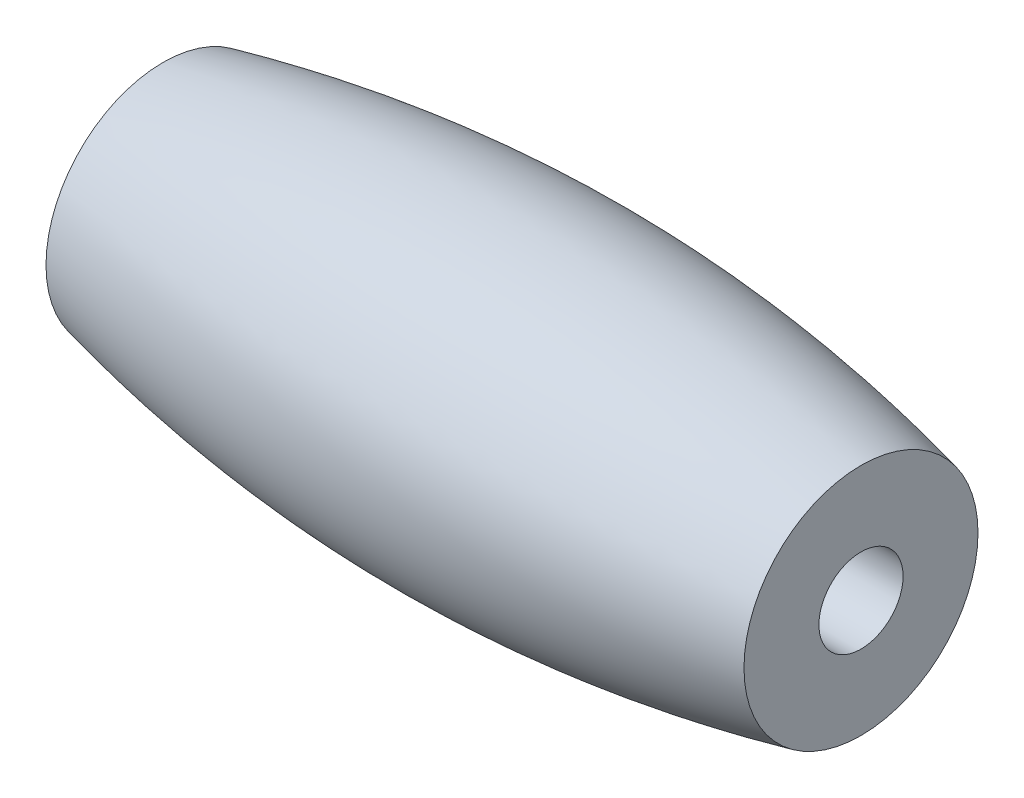
ISO-10303-21;
HEADER;
FILE_DESCRIPTION(('STEP AP214'),'2;1');
FILE_NAME('part.step','',(''),(''),'','','');
FILE_SCHEMA(('AUTOMOTIVE_DESIGN { 1 0 10303 214 1 1 1 1 }'));
ENDSEC;
DATA;
#1=APPLICATION_CONTEXT('core data for automotive mechanical design processes');
#2=APPLICATION_PROTOCOL_DEFINITION('international standard','automotive_design',2000,#1);
#3=PRODUCT_CONTEXT('',#1,'mechanical');
#4=PRODUCT('Part','Part','',(#3));
#5=PRODUCT_RELATED_PRODUCT_CATEGORY('part','',(#4));
#6=PRODUCT_DEFINITION_FORMATION('','',#4);
#7=PRODUCT_DEFINITION_CONTEXT('part definition',#1,'design');
#8=PRODUCT_DEFINITION('design','',#6,#7);
#9=PRODUCT_DEFINITION_SHAPE('','',#8);
#10=(LENGTH_UNIT() NAMED_UNIT(*) SI_UNIT(.MILLI.,.METRE.));
#11=(NAMED_UNIT(*) PLANE_ANGLE_UNIT() SI_UNIT($,.RADIAN.));
#12=(NAMED_UNIT(*) SI_UNIT($,.STERADIAN.) SOLID_ANGLE_UNIT());
#13=UNCERTAINTY_MEASURE_WITH_UNIT(LENGTH_MEASURE(1.E-05),#10,'distance_accuracy_value','');
#14=(GEOMETRIC_REPRESENTATION_CONTEXT(3) GLOBAL_UNCERTAINTY_ASSIGNED_CONTEXT((#13)) GLOBAL_UNIT_ASSIGNED_CONTEXT((#10,
#11,#12)) REPRESENTATION_CONTEXT('',''));
#15=CARTESIAN_POINT('',(0.,0.,0.));
#16=DIRECTION('',(0.,0.,1.));
#17=DIRECTION('',(1.,0.,0.));
#18=AXIS2_PLACEMENT_3D('',#15,#16,#17);
#19=CARTESIAN_POINT('',(7.43351921830541,4.41324999999347,0.232298874660018));
#20=CARTESIAN_POINT('',(-5.7299807817133,7.45682345382579,0.232298874660018));
#21=CARTESIAN_POINT('',(-18.8934807817321,4.41324999999593,0.232298874660018));
#22=B_SPLINE_CURVE_WITH_KNOTS('',2,(#19,#20,#21),.UNSPECIFIED.,.F.,.F.,(3,3),(0.,1.),.UNSPECIFIED.);
#23=CARTESIAN_POINT('',(-18.8934807817418,0.,0.232298874660018));
#24=DIRECTION('',(1.,0.,0.));
#25=AXIS1_PLACEMENT('',#23,#24);
#26=SURFACE_OF_REVOLUTION('',#22,#25);
#27=CARTESIAN_POINT('',(-18.8934807817321,0.,0.232298874660018));
#28=DIRECTION('',(1.,0.,0.));
#29=DIRECTION('',(0.,0.,-1.));
#30=AXIS2_PLACEMENT_3D('',#27,#28,#29);
#31=CIRCLE('',#30,4.41324999999593);
#32=CARTESIAN_POINT('',(-18.8934807817321,0.,-4.18095112533592));
#33=VERTEX_POINT('',#32);
#34=EDGE_CURVE('E9',#33,#33,#31,.T.);
#35=ORIENTED_EDGE('',*,*,#34,.T.);
#36=EDGE_LOOP('',(#35));
#37=FACE_BOUND('',#36,.T.);
#38=CARTESIAN_POINT('',(7.43351921830542,0.,0.232298874660018));
#39=DIRECTION('',(1.,0.,0.));
#40=DIRECTION('',(0.,0.,-1.));
#41=AXIS2_PLACEMENT_3D('',#38,#39,#40);
#42=CIRCLE('',#41,4.41324999999347);
#43=CARTESIAN_POINT('',(7.43351921830542,0.,-4.18095112533345));
#44=VERTEX_POINT('',#43);
#45=EDGE_CURVE('E28',#44,#44,#42,.T.);
#46=ORIENTED_EDGE('',*,*,#45,.F.);
#47=EDGE_LOOP('',(#46));
#48=FACE_BOUND('',#47,.T.);
#49=ADVANCED_FACE('F13',(#37,#48),#26,.F.);
#50=CARTESIAN_POINT('',(-18.8934807817321,4.41324999999593,0.232298874660018));
#51=DIRECTION('',(-1.,0.,0.));
#52=DIRECTION('',(0.,0.,1.));
#53=AXIS2_PLACEMENT_3D('',#50,#51,#52);
#54=PLANE('',#53);
#55=CARTESIAN_POINT('',(-18.8934807817321,0.,0.232298874660018));
#56=DIRECTION('',(1.,0.,0.));
#57=DIRECTION('',(0.,0.,-1.));
#58=AXIS2_PLACEMENT_3D('',#55,#56,#57);
#59=CIRCLE('',#58,1.5875);
#60=CARTESIAN_POINT('',(-18.8934807817321,0.,-1.35520112533998));
#61=VERTEX_POINT('',#60);
#62=EDGE_CURVE('E20',#61,#61,#59,.T.);
#63=ORIENTED_EDGE('',*,*,#62,.T.);
#64=EDGE_LOOP('',(#63));
#65=FACE_BOUND('',#64,.T.);
#66=ORIENTED_EDGE('',*,*,#34,.F.);
#67=EDGE_LOOP('',(#66));
#68=FACE_BOUND('',#67,.T.);
#69=ADVANCED_FACE('F44',(#65,#68),#54,.T.);
#70=CARTESIAN_POINT('',(-18.8934807817418,0.,0.232298874660018));
#71=DIRECTION('',(1.,0.,0.));
#72=DIRECTION('',(0.,0.,-1.));
#73=AXIS2_PLACEMENT_3D('',#70,#71,#72);
#74=CYLINDRICAL_SURFACE('',#73,1.5875);
#75=CARTESIAN_POINT('',(7.43351921830542,0.,0.232298874660018));
#76=DIRECTION('',(1.,0.,0.));
#77=DIRECTION('',(0.,0.,-1.));
#78=AXIS2_PLACEMENT_3D('',#75,#76,#77);
#79=CIRCLE('',#78,1.5875);
#80=CARTESIAN_POINT('',(7.43351921830542,0.,-1.35520112533998));
#81=VERTEX_POINT('',#80);
#82=EDGE_CURVE('E24',#81,#81,#79,.T.);
#83=ORIENTED_EDGE('',*,*,#82,.T.);
#84=EDGE_LOOP('',(#83));
#85=FACE_BOUND('',#84,.T.);
#86=ORIENTED_EDGE('',*,*,#62,.F.);
#87=EDGE_LOOP('',(#86));
#88=FACE_BOUND('',#87,.T.);
#89=ADVANCED_FACE('F50',(#85,#88),#74,.F.);
#90=CARTESIAN_POINT('',(7.43351921830541,1.5875,0.232298874660018));
#91=DIRECTION('',(1.,0.,0.));
#92=DIRECTION('',(0.,0.,-1.));
#93=AXIS2_PLACEMENT_3D('',#90,#91,#92);
#94=PLANE('',#93);
#95=ORIENTED_EDGE('',*,*,#45,.T.);
#96=EDGE_LOOP('',(#95));
#97=FACE_BOUND('',#96,.T.);
#98=ORIENTED_EDGE('',*,*,#82,.F.);
#99=EDGE_LOOP('',(#98));
#100=FACE_BOUND('',#99,.T.);
#101=ADVANCED_FACE('F40',(#97,#100),#94,.T.);
#102=CLOSED_SHELL('',(#49,#69,#89,#101));
#103=MANIFOLD_SOLID_BREP('B1',#102);
#104=ADVANCED_BREP_SHAPE_REPRESENTATION('',(#18,#103),#14);
#105=SHAPE_DEFINITION_REPRESENTATION(#9,#104);
ENDSEC;
END-ISO-10303-21;
